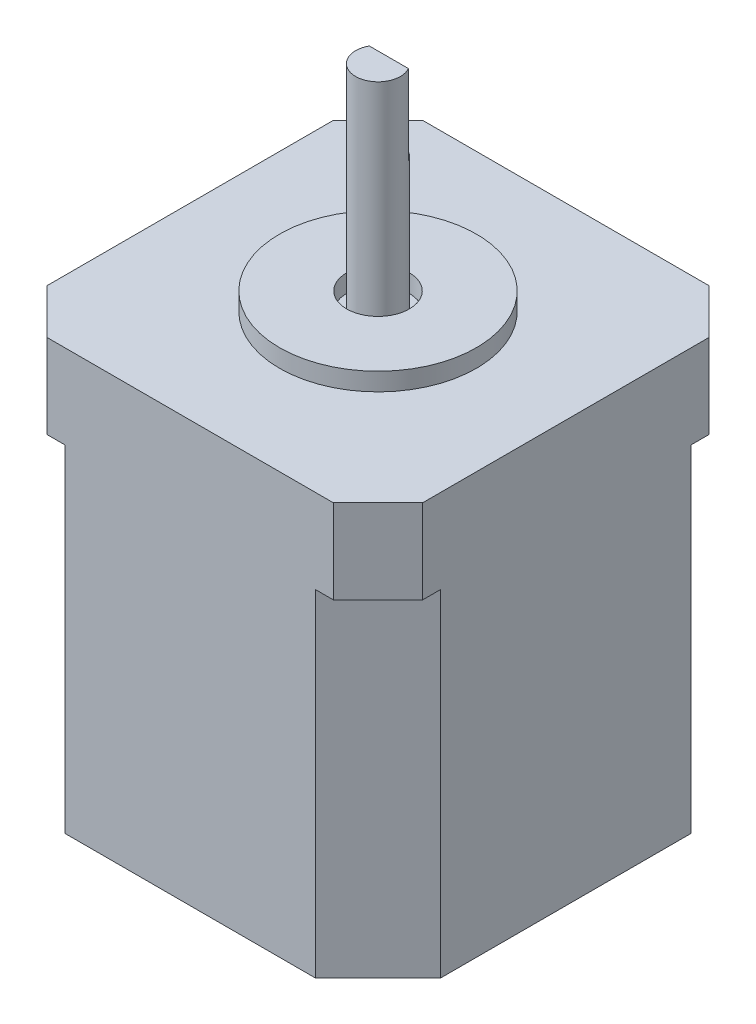
ISO-10303-21;
HEADER;
FILE_DESCRIPTION(('STEP AP214'),'2;1');
FILE_NAME('part.step','',(''),(''),'','','');
FILE_SCHEMA(('AUTOMOTIVE_DESIGN { 1 0 10303 214 1 1 1 1 }'));
ENDSEC;
DATA;
#1=APPLICATION_CONTEXT('core data for automotive mechanical design processes');
#2=APPLICATION_PROTOCOL_DEFINITION('international standard','automotive_design',2000,#1);
#3=PRODUCT_CONTEXT('',#1,'mechanical');
#4=PRODUCT('Part','Part','',(#3));
#5=PRODUCT_RELATED_PRODUCT_CATEGORY('part','',(#4));
#6=PRODUCT_DEFINITION_FORMATION('','',#4);
#7=PRODUCT_DEFINITION_CONTEXT('part definition',#1,'design');
#8=PRODUCT_DEFINITION('design','',#6,#7);
#9=PRODUCT_DEFINITION_SHAPE('','',#8);
#10=(LENGTH_UNIT() NAMED_UNIT(*) SI_UNIT(.MILLI.,.METRE.));
#11=(NAMED_UNIT(*) PLANE_ANGLE_UNIT() SI_UNIT($,.RADIAN.));
#12=(NAMED_UNIT(*) SI_UNIT($,.STERADIAN.) SOLID_ANGLE_UNIT());
#13=UNCERTAINTY_MEASURE_WITH_UNIT(LENGTH_MEASURE(1.E-05),#10,'distance_accuracy_value','');
#14=(GEOMETRIC_REPRESENTATION_CONTEXT(3) GLOBAL_UNCERTAINTY_ASSIGNED_CONTEXT((#13)) GLOBAL_UNIT_ASSIGNED_CONTEXT((#10,
#11,#12)) REPRESENTATION_CONTEXT('',''));
#15=CARTESIAN_POINT('',(0.,0.,0.));
#16=DIRECTION('',(0.,0.,1.));
#17=DIRECTION('',(1.,0.,0.));
#18=AXIS2_PLACEMENT_3D('',#15,#16,#17);
#19=CARTESIAN_POINT('',(0.,71.,0.));
#20=DIRECTION('',(0.,-1.,0.));
#21=DIRECTION('',(0.,0.,-1.));
#22=AXIS2_PLACEMENT_3D('',#19,#20,#21);
#23=CYLINDRICAL_SURFACE('',#22,2.5);
#24=CARTESIAN_POINT('',(0.,47.,0.));
#25=DIRECTION('',(0.,-1.,0.));
#26=DIRECTION('',(0.,0.,-1.));
#27=AXIS2_PLACEMENT_3D('',#24,#25,#26);
#28=CIRCLE('',#27,2.5);
#29=CARTESIAN_POINT('',(0.,47.,-2.5));
#30=VERTEX_POINT('',#29);
#31=EDGE_CURVE('E194',#30,#30,#28,.F.);
#32=ORIENTED_EDGE('',*,*,#31,.T.);
#33=EDGE_LOOP('',(#32));
#34=FACE_BOUND('',#33,.T.);
#35=DIRECTION('',(0.,-1.,0.));
#36=VECTOR('',#35,1.);
#37=CARTESIAN_POINT('',(2.18278026465211,71.,-1.21879871851149));
#38=LINE('',#37,#36);
#39=CARTESIAN_POINT('',(2.18278026465211,71.,-1.21879871851149));
#40=VERTEX_POINT('',#39);
#41=CARTESIAN_POINT('',(2.18278026465211,62.,-1.21879871851149));
#42=VERTEX_POINT('',#41);
#43=EDGE_CURVE('E165',#40,#42,#38,.T.);
#44=ORIENTED_EDGE('',*,*,#43,.F.);
#45=CARTESIAN_POINT('',(0.,71.,0.));
#46=DIRECTION('',(0.,1.,0.));
#47=DIRECTION('',(0.,0.,1.));
#48=AXIS2_PLACEMENT_3D('',#45,#46,#47);
#49=CIRCLE('',#48,2.5);
#50=CARTESIAN_POINT('',(-2.18278026465211,71.,-1.21879871851149));
#51=VERTEX_POINT('',#50);
#52=EDGE_CURVE('E173',#51,#40,#49,.T.);
#53=ORIENTED_EDGE('',*,*,#52,.F.);
#54=DIRECTION('',(0.,-1.,0.));
#55=VECTOR('',#54,1.);
#56=CARTESIAN_POINT('',(-2.18278026465211,71.,-1.21879871851149));
#57=LINE('',#56,#55);
#58=CARTESIAN_POINT('',(-2.18278026465211,62.,-1.21879871851149));
#59=VERTEX_POINT('',#58);
#60=EDGE_CURVE('E56',#59,#51,#57,.F.);
#61=ORIENTED_EDGE('',*,*,#60,.F.);
#62=CARTESIAN_POINT('',(0.,62.,0.));
#63=DIRECTION('',(0.,1.,0.));
#64=DIRECTION('',(0.,0.,1.));
#65=AXIS2_PLACEMENT_3D('',#62,#63,#64);
#66=CIRCLE('',#65,2.5);
#67=EDGE_CURVE('E12',#42,#59,#66,.T.);
#68=ORIENTED_EDGE('',*,*,#67,.F.);
#69=EDGE_LOOP('',(#44,#53,#61,#68));
#70=FACE_BOUND('',#69,.T.);
#71=ADVANCED_FACE('F41',(#34,#70),#23,.T.);
#72=CARTESIAN_POINT('',(0.,71.,0.));
#73=DIRECTION('',(0.,1.,0.));
#74=DIRECTION('',(0.,0.,1.));
#75=AXIS2_PLACEMENT_3D('',#72,#73,#74);
#76=PLANE('',#75);
#77=ORIENTED_EDGE('',*,*,#52,.T.);
#78=DIRECTION('',(-1.,0.,0.));
#79=VECTOR('',#78,1.);
#80=CARTESIAN_POINT('',(0.,71.,-1.21879871851149));
#81=LINE('',#80,#79);
#82=EDGE_CURVE('E49',#40,#51,#81,.T.);
#83=ORIENTED_EDGE('',*,*,#82,.T.);
#84=EDGE_LOOP('',(#77,#83));
#85=FACE_BOUND('',#84,.T.);
#86=ADVANCED_FACE('F306',(#85),#76,.T.);
#87=CARTESIAN_POINT('',(-21.,9.4,21.));
#88=DIRECTION('',(0.,0.,-1.));
#89=DIRECTION('',(-1.,0.,0.));
#90=AXIS2_PLACEMENT_3D('',#87,#88,#89);
#91=PLANE('',#90);
#92=DIRECTION('',(1.,0.,0.));
#93=VECTOR('',#92,1.);
#94=CARTESIAN_POINT('',(-21.,47.,21.));
#95=LINE('',#94,#93);
#96=CARTESIAN_POINT('',(-16.,47.,21.));
#97=VERTEX_POINT('',#96);
#98=CARTESIAN_POINT('',(16.,47.,21.));
#99=VERTEX_POINT('',#98);
#100=EDGE_CURVE('E205',#97,#99,#95,.T.);
#101=ORIENTED_EDGE('',*,*,#100,.F.);
#102=DIRECTION('',(0.,-1.,0.));
#103=VECTOR('',#102,1.);
#104=CARTESIAN_POINT('',(-16.,37.6,21.));
#105=LINE('',#104,#103);
#106=CARTESIAN_POINT('',(-16.,37.6,21.));
#107=VERTEX_POINT('',#106);
#108=EDGE_CURVE('E272',#97,#107,#105,.T.);
#109=ORIENTED_EDGE('',*,*,#108,.T.);
#110=DIRECTION('',(1.,0.,0.));
#111=VECTOR('',#110,1.);
#112=CARTESIAN_POINT('',(-21.,37.6,21.));
#113=LINE('',#112,#111);
#114=CARTESIAN_POINT('',(-14.,37.6,21.));
#115=VERTEX_POINT('',#114);
#116=EDGE_CURVE('E199',#107,#115,#113,.T.);
#117=ORIENTED_EDGE('',*,*,#116,.T.);
#118=DIRECTION('',(0.,-1.,0.));
#119=VECTOR('',#118,1.);
#120=CARTESIAN_POINT('',(-14.,9.4,21.));
#121=LINE('',#120,#119);
#122=CARTESIAN_POINT('',(-14.,0.,21.));
#123=VERTEX_POINT('',#122);
#124=EDGE_CURVE('E243',#115,#123,#121,.T.);
#125=ORIENTED_EDGE('',*,*,#124,.T.);
#126=DIRECTION('',(1.,0.,0.));
#127=VECTOR('',#126,1.);
#128=CARTESIAN_POINT('',(-21.,0.,21.));
#129=LINE('',#128,#127);
#130=CARTESIAN_POINT('',(13.9999999999999,0.,21.));
#131=VERTEX_POINT('',#130);
#132=EDGE_CURVE('E208',#123,#131,#129,.T.);
#133=ORIENTED_EDGE('',*,*,#132,.T.);
#134=DIRECTION('',(0.,1.,0.));
#135=VECTOR('',#134,1.);
#136=CARTESIAN_POINT('',(14.,9.4,21.));
#137=LINE('',#136,#135);
#138=CARTESIAN_POINT('',(13.9999999999999,37.6,21.));
#139=VERTEX_POINT('',#138);
#140=EDGE_CURVE('E246',#131,#139,#137,.T.);
#141=ORIENTED_EDGE('',*,*,#140,.T.);
#142=CARTESIAN_POINT('',(16.,37.6,21.));
#143=VERTEX_POINT('',#142);
#144=EDGE_CURVE('E217',#139,#143,#113,.T.);
#145=ORIENTED_EDGE('',*,*,#144,.T.);
#146=DIRECTION('',(0.,1.,0.));
#147=VECTOR('',#146,1.);
#148=CARTESIAN_POINT('',(16.,9.4,21.));
#149=LINE('',#148,#147);
#150=EDGE_CURVE('E270',#143,#99,#149,.T.);
#151=ORIENTED_EDGE('',*,*,#150,.T.);
#152=EDGE_LOOP('',(#101,#109,#117,#125,#133,#141,#145,#151));
#153=FACE_BOUND('',#152,.T.);
#154=ADVANCED_FACE('F308',(#153),#91,.F.);
#155=CARTESIAN_POINT('',(21.,9.4,21.));
#156=DIRECTION('',(-1.,0.,0.));
#157=DIRECTION('',(0.,0.,1.));
#158=AXIS2_PLACEMENT_3D('',#155,#156,#157);
#159=PLANE('',#158);
#160=DIRECTION('',(0.,0.,-1.));
#161=VECTOR('',#160,1.);
#162=CARTESIAN_POINT('',(21.,47.,21.));
#163=LINE('',#162,#161);
#164=CARTESIAN_POINT('',(21.,47.,16.));
#165=VERTEX_POINT('',#164);
#166=CARTESIAN_POINT('',(21.,47.,-16.));
#167=VERTEX_POINT('',#166);
#168=EDGE_CURVE('E195',#165,#167,#163,.T.);
#169=ORIENTED_EDGE('',*,*,#168,.F.);
#170=DIRECTION('',(0.,-1.,0.));
#171=VECTOR('',#170,1.);
#172=CARTESIAN_POINT('',(21.,9.4,16.));
#173=LINE('',#172,#171);
#174=CARTESIAN_POINT('',(21.,37.6,16.));
#175=VERTEX_POINT('',#174);
#176=EDGE_CURVE('E292',#165,#175,#173,.T.);
#177=ORIENTED_EDGE('',*,*,#176,.T.);
#178=DIRECTION('',(0.,0.,-1.));
#179=VECTOR('',#178,1.);
#180=CARTESIAN_POINT('',(21.,37.6,21.));
#181=LINE('',#180,#179);
#182=CARTESIAN_POINT('',(21.,37.6,14.));
#183=VERTEX_POINT('',#182);
#184=EDGE_CURVE('E209',#175,#183,#181,.T.);
#185=ORIENTED_EDGE('',*,*,#184,.T.);
#186=DIRECTION('',(0.,-1.,0.));
#187=VECTOR('',#186,1.);
#188=CARTESIAN_POINT('',(21.,9.4,14.));
#189=LINE('',#188,#187);
#190=CARTESIAN_POINT('',(21.,0.,14.));
#191=VERTEX_POINT('',#190);
#192=EDGE_CURVE('E232',#183,#191,#189,.T.);
#193=ORIENTED_EDGE('',*,*,#192,.T.);
#194=DIRECTION('',(0.,0.,-1.));
#195=VECTOR('',#194,1.);
#196=CARTESIAN_POINT('',(21.,0.,21.));
#197=LINE('',#196,#195);
#198=CARTESIAN_POINT('',(21.,0.,-14.));
#199=VERTEX_POINT('',#198);
#200=EDGE_CURVE('E221',#191,#199,#197,.T.);
#201=ORIENTED_EDGE('',*,*,#200,.T.);
#202=DIRECTION('',(0.,1.,0.));
#203=VECTOR('',#202,1.);
#204=CARTESIAN_POINT('',(21.,37.6,-14.));
#205=LINE('',#204,#203);
#206=CARTESIAN_POINT('',(21.,37.6,-14.));
#207=VERTEX_POINT('',#206);
#208=EDGE_CURVE('E230',#199,#207,#205,.T.);
#209=ORIENTED_EDGE('',*,*,#208,.T.);
#210=CARTESIAN_POINT('',(21.,37.6,-16.));
#211=VERTEX_POINT('',#210);
#212=EDGE_CURVE('E190',#207,#211,#181,.T.);
#213=ORIENTED_EDGE('',*,*,#212,.T.);
#214=DIRECTION('',(0.,1.,0.));
#215=VECTOR('',#214,1.);
#216=CARTESIAN_POINT('',(21.,47.,-16.));
#217=LINE('',#216,#215);
#218=EDGE_CURVE('E290',#211,#167,#217,.T.);
#219=ORIENTED_EDGE('',*,*,#218,.T.);
#220=EDGE_LOOP('',(#169,#177,#185,#193,#201,#209,#213,#219));
#221=FACE_BOUND('',#220,.T.);
#222=ADVANCED_FACE('F314',(#221),#159,.F.);
#223=CARTESIAN_POINT('',(-21.,9.4,-21.));
#224=DIRECTION('',(0.,0.,-1.));
#225=DIRECTION('',(-1.,0.,0.));
#226=AXIS2_PLACEMENT_3D('',#223,#224,#225);
#227=PLANE('',#226);
#228=DIRECTION('',(-1.,0.,0.));
#229=VECTOR('',#228,1.);
#230=CARTESIAN_POINT('',(-21.,37.6,-21.));
#231=LINE('',#230,#229);
#232=CARTESIAN_POINT('',(-14.,37.6,-21.));
#233=VERTEX_POINT('',#232);
#234=CARTESIAN_POINT('',(-16.,37.6,-21.));
#235=VERTEX_POINT('',#234);
#236=EDGE_CURVE('E211',#233,#235,#231,.T.);
#237=ORIENTED_EDGE('',*,*,#236,.T.);
#238=DIRECTION('',(0.,1.,0.));
#239=VECTOR('',#238,1.);
#240=CARTESIAN_POINT('',(-16.,9.4,-21.));
#241=LINE('',#240,#239);
#242=CARTESIAN_POINT('',(-16.,47.,-21.));
#243=VERTEX_POINT('',#242);
#244=EDGE_CURVE('E301',#235,#243,#241,.T.);
#245=ORIENTED_EDGE('',*,*,#244,.T.);
#246=DIRECTION('',(-1.,0.,0.));
#247=VECTOR('',#246,1.);
#248=CARTESIAN_POINT('',(-21.,47.,-21.));
#249=LINE('',#248,#247);
#250=CARTESIAN_POINT('',(16.,47.,-21.));
#251=VERTEX_POINT('',#250);
#252=EDGE_CURVE('E198',#251,#243,#249,.T.);
#253=ORIENTED_EDGE('',*,*,#252,.F.);
#254=DIRECTION('',(0.,-1.,0.));
#255=VECTOR('',#254,1.);
#256=CARTESIAN_POINT('',(16.,37.6,-21.));
#257=LINE('',#256,#255);
#258=CARTESIAN_POINT('',(16.,37.6,-21.));
#259=VERTEX_POINT('',#258);
#260=EDGE_CURVE('E299',#251,#259,#257,.T.);
#261=ORIENTED_EDGE('',*,*,#260,.T.);
#262=CARTESIAN_POINT('',(13.9999999999999,37.6,-21.));
#263=VERTEX_POINT('',#262);
#264=EDGE_CURVE('E212',#259,#263,#231,.T.);
#265=ORIENTED_EDGE('',*,*,#264,.T.);
#266=DIRECTION('',(0.,-1.,0.));
#267=VECTOR('',#266,1.);
#268=CARTESIAN_POINT('',(14.,9.4,-21.));
#269=LINE('',#268,#267);
#270=CARTESIAN_POINT('',(13.9999999999999,0.,-21.));
#271=VERTEX_POINT('',#270);
#272=EDGE_CURVE('E265',#263,#271,#269,.T.);
#273=ORIENTED_EDGE('',*,*,#272,.T.);
#274=DIRECTION('',(1.,0.,0.));
#275=VECTOR('',#274,1.);
#276=CARTESIAN_POINT('',(-21.,0.,-21.));
#277=LINE('',#276,#275);
#278=CARTESIAN_POINT('',(-14.,0.,-21.));
#279=VERTEX_POINT('',#278);
#280=EDGE_CURVE('E224',#279,#271,#277,.T.);
#281=ORIENTED_EDGE('',*,*,#280,.F.);
#282=DIRECTION('',(0.,1.,0.));
#283=VECTOR('',#282,1.);
#284=CARTESIAN_POINT('',(-14.,9.4,-21.));
#285=LINE('',#284,#283);
#286=EDGE_CURVE('E268',#279,#233,#285,.T.);
#287=ORIENTED_EDGE('',*,*,#286,.T.);
#288=EDGE_LOOP('',(#237,#245,#253,#261,#265,#273,#281,#287));
#289=FACE_BOUND('',#288,.T.);
#290=ADVANCED_FACE('F354',(#289),#227,.T.);
#291=CARTESIAN_POINT('',(-21.,9.4,21.));
#292=DIRECTION('',(-1.,0.,0.));
#293=DIRECTION('',(0.,0.,1.));
#294=AXIS2_PLACEMENT_3D('',#291,#292,#293);
#295=PLANE('',#294);
#296=DIRECTION('',(0.,0.,1.));
#297=VECTOR('',#296,1.);
#298=CARTESIAN_POINT('',(-21.,37.6,21.));
#299=LINE('',#298,#297);
#300=CARTESIAN_POINT('',(-21.,37.6,14.));
#301=VERTEX_POINT('',#300);
#302=CARTESIAN_POINT('',(-21.,37.6,16.));
#303=VERTEX_POINT('',#302);
#304=EDGE_CURVE('E214',#301,#303,#299,.T.);
#305=ORIENTED_EDGE('',*,*,#304,.T.);
#306=DIRECTION('',(0.,1.,0.));
#307=VECTOR('',#306,1.);
#308=CARTESIAN_POINT('',(-21.,47.,16.));
#309=LINE('',#308,#307);
#310=CARTESIAN_POINT('',(-21.,47.,16.));
#311=VERTEX_POINT('',#310);
#312=EDGE_CURVE('E280',#303,#311,#309,.T.);
#313=ORIENTED_EDGE('',*,*,#312,.T.);
#314=DIRECTION('',(0.,0.,1.));
#315=VECTOR('',#314,1.);
#316=CARTESIAN_POINT('',(-21.,47.,21.));
#317=LINE('',#316,#315);
#318=CARTESIAN_POINT('',(-21.,47.,-16.));
#319=VERTEX_POINT('',#318);
#320=EDGE_CURVE('E202',#319,#311,#317,.T.);
#321=ORIENTED_EDGE('',*,*,#320,.F.);
#322=DIRECTION('',(0.,-1.,0.));
#323=VECTOR('',#322,1.);
#324=CARTESIAN_POINT('',(-21.,9.4,-16.));
#325=LINE('',#324,#323);
#326=CARTESIAN_POINT('',(-21.,37.6,-16.));
#327=VERTEX_POINT('',#326);
#328=EDGE_CURVE('E277',#319,#327,#325,.T.);
#329=ORIENTED_EDGE('',*,*,#328,.T.);
#330=CARTESIAN_POINT('',(-21.,37.6,-14.));
#331=VERTEX_POINT('',#330);
#332=EDGE_CURVE('E215',#327,#331,#299,.T.);
#333=ORIENTED_EDGE('',*,*,#332,.T.);
#334=DIRECTION('',(0.,-1.,0.));
#335=VECTOR('',#334,1.);
#336=CARTESIAN_POINT('',(-21.,9.4,-14.));
#337=LINE('',#336,#335);
#338=CARTESIAN_POINT('',(-21.,0.,-14.));
#339=VERTEX_POINT('',#338);
#340=EDGE_CURVE('E260',#331,#339,#337,.T.);
#341=ORIENTED_EDGE('',*,*,#340,.T.);
#342=DIRECTION('',(0.,0.,-1.));
#343=VECTOR('',#342,1.);
#344=CARTESIAN_POINT('',(-21.,0.,21.));
#345=LINE('',#344,#343);
#346=CARTESIAN_POINT('',(-21.,0.,14.));
#347=VERTEX_POINT('',#346);
#348=EDGE_CURVE('E227',#347,#339,#345,.T.);
#349=ORIENTED_EDGE('',*,*,#348,.F.);
#350=DIRECTION('',(0.,1.,0.));
#351=VECTOR('',#350,1.);
#352=CARTESIAN_POINT('',(-21.,37.6,14.));
#353=LINE('',#352,#351);
#354=EDGE_CURVE('E263',#347,#301,#353,.T.);
#355=ORIENTED_EDGE('',*,*,#354,.T.);
#356=EDGE_LOOP('',(#305,#313,#321,#329,#333,#341,#349,#355));
#357=FACE_BOUND('',#356,.T.);
#358=ADVANCED_FACE('F350',(#357),#295,.T.);
#359=CARTESIAN_POINT('',(0.,0.,0.));
#360=DIRECTION('',(0.,1.,0.));
#361=DIRECTION('',(0.,0.,1.));
#362=AXIS2_PLACEMENT_3D('',#359,#360,#361);
#363=PLANE('',#362);
#364=ORIENTED_EDGE('',*,*,#200,.F.);
#365=DIRECTION('',(0.707106781186549,0.,-0.707106781186546));
#366=VECTOR('',#365,1.);
#367=CARTESIAN_POINT('',(21.,0.,14.));
#368=LINE('',#367,#366);
#369=EDGE_CURVE('E241',#191,#131,#368,.F.);
#370=ORIENTED_EDGE('',*,*,#369,.T.);
#371=ORIENTED_EDGE('',*,*,#132,.F.);
#372=DIRECTION('',(-0.707106781186546,0.,-0.707106781186549));
#373=VECTOR('',#372,1.);
#374=CARTESIAN_POINT('',(-14.,0.,21.));
#375=LINE('',#374,#373);
#376=EDGE_CURVE('E239',#123,#347,#375,.T.);
#377=ORIENTED_EDGE('',*,*,#376,.T.);
#378=ORIENTED_EDGE('',*,*,#348,.T.);
#379=DIRECTION('',(-0.707106781186549,0.,0.707106781186547));
#380=VECTOR('',#379,1.);
#381=CARTESIAN_POINT('',(-21.,0.,-14.));
#382=LINE('',#381,#380);
#383=EDGE_CURVE('E237',#339,#279,#382,.F.);
#384=ORIENTED_EDGE('',*,*,#383,.T.);
#385=ORIENTED_EDGE('',*,*,#280,.T.);
#386=DIRECTION('',(0.707106781186549,0.,0.707106781186546));
#387=VECTOR('',#386,1.);
#388=CARTESIAN_POINT('',(14.,0.,-21.));
#389=LINE('',#388,#387);
#390=EDGE_CURVE('E235',#271,#199,#389,.T.);
#391=ORIENTED_EDGE('',*,*,#390,.T.);
#392=EDGE_LOOP('',(#364,#370,#371,#377,#378,#384,#385,#391));
#393=FACE_BOUND('',#392,.T.);
#394=ADVANCED_FACE('F346',(#393),#363,.F.);
#395=CARTESIAN_POINT('',(21.,9.4,14.));
#396=DIRECTION('',(-0.707106781186546,0.,-0.707106781186549));
#397=DIRECTION('',(0.,-1.,0.));
#398=AXIS2_PLACEMENT_3D('',#395,#396,#397);
#399=PLANE('',#398);
#400=DIRECTION('',(-0.707106781186549,0.,0.707106781186546));
#401=VECTOR('',#400,1.);
#402=CARTESIAN_POINT('',(21.,37.6,14.));
#403=LINE('',#402,#401);
#404=EDGE_CURVE('E257',#139,#183,#403,.F.);
#405=ORIENTED_EDGE('',*,*,#404,.F.);
#406=ORIENTED_EDGE('',*,*,#140,.F.);
#407=ORIENTED_EDGE('',*,*,#369,.F.);
#408=ORIENTED_EDGE('',*,*,#192,.F.);
#409=EDGE_LOOP('',(#405,#406,#407,#408));
#410=FACE_BOUND('',#409,.T.);
#411=ADVANCED_FACE('F349',(#410),#399,.F.);
#412=CARTESIAN_POINT('',(-14.,9.4,21.));
#413=DIRECTION('',(-0.707106781186549,0.,0.707106781186546));
#414=DIRECTION('',(0.,1.,0.));
#415=AXIS2_PLACEMENT_3D('',#412,#413,#414);
#416=PLANE('',#415);
#417=DIRECTION('',(0.707106781186546,0.,0.707106781186549));
#418=VECTOR('',#417,1.);
#419=CARTESIAN_POINT('',(-14.,37.6,21.));
#420=LINE('',#419,#418);
#421=EDGE_CURVE('E254',#301,#115,#420,.T.);
#422=ORIENTED_EDGE('',*,*,#421,.F.);
#423=ORIENTED_EDGE('',*,*,#354,.F.);
#424=ORIENTED_EDGE('',*,*,#376,.F.);
#425=ORIENTED_EDGE('',*,*,#124,.F.);
#426=EDGE_LOOP('',(#422,#423,#424,#425));
#427=FACE_BOUND('',#426,.T.);
#428=ADVANCED_FACE('F364',(#427),#416,.T.);
#429=CARTESIAN_POINT('',(-21.,9.4,-14.));
#430=DIRECTION('',(0.707106781186546,0.,0.707106781186548));
#431=DIRECTION('',(0.,-1.,0.));
#432=AXIS2_PLACEMENT_3D('',#429,#430,#431);
#433=PLANE('',#432);
#434=DIRECTION('',(0.707106781186549,0.,-0.707106781186547));
#435=VECTOR('',#434,1.);
#436=CARTESIAN_POINT('',(-21.,37.6,-14.));
#437=LINE('',#436,#435);
#438=EDGE_CURVE('E251',#233,#331,#437,.F.);
#439=ORIENTED_EDGE('',*,*,#438,.F.);
#440=ORIENTED_EDGE('',*,*,#286,.F.);
#441=ORIENTED_EDGE('',*,*,#383,.F.);
#442=ORIENTED_EDGE('',*,*,#340,.F.);
#443=EDGE_LOOP('',(#439,#440,#441,#442));
#444=FACE_BOUND('',#443,.T.);
#445=ADVANCED_FACE('F368',(#444),#433,.F.);
#446=CARTESIAN_POINT('',(14.,9.4,-21.));
#447=DIRECTION('',(0.707106781186546,0.,-0.707106781186549));
#448=DIRECTION('',(0.,1.,0.));
#449=AXIS2_PLACEMENT_3D('',#446,#447,#448);
#450=PLANE('',#449);
#451=DIRECTION('',(-0.707106781186549,0.,-0.707106781186546));
#452=VECTOR('',#451,1.);
#453=CARTESIAN_POINT('',(14.,37.6,-21.));
#454=LINE('',#453,#452);
#455=EDGE_CURVE('E248',#207,#263,#454,.T.);
#456=ORIENTED_EDGE('',*,*,#455,.F.);
#457=ORIENTED_EDGE('',*,*,#208,.F.);
#458=ORIENTED_EDGE('',*,*,#390,.F.);
#459=ORIENTED_EDGE('',*,*,#272,.F.);
#460=EDGE_LOOP('',(#456,#457,#458,#459));
#461=FACE_BOUND('',#460,.T.);
#462=ADVANCED_FACE('F372',(#461),#450,.T.);
#463=CARTESIAN_POINT('',(0.,37.6,0.));
#464=DIRECTION('',(0.,-1.,0.));
#465=DIRECTION('',(0.,0.,-1.));
#466=AXIS2_PLACEMENT_3D('',#463,#464,#465);
#467=PLANE('',#466);
#468=ORIENTED_EDGE('',*,*,#184,.F.);
#469=DIRECTION('',(0.707106781186549,0.,-0.707106781186546));
#470=VECTOR('',#469,1.);
#471=CARTESIAN_POINT('',(18.4999999999999,37.6,18.5));
#472=LINE('',#471,#470);
#473=EDGE_CURVE('E295',#175,#143,#472,.F.);
#474=ORIENTED_EDGE('',*,*,#473,.T.);
#475=ORIENTED_EDGE('',*,*,#144,.F.);
#476=ORIENTED_EDGE('',*,*,#404,.T.);
#477=EDGE_LOOP('',(#468,#474,#475,#476));
#478=FACE_BOUND('',#477,.T.);
#479=ADVANCED_FACE('F345',(#478),#467,.T.);
#480=ORIENTED_EDGE('',*,*,#264,.F.);
#481=DIRECTION('',(0.707106781186546,0.,0.70710678118655));
#482=VECTOR('',#481,1.);
#483=CARTESIAN_POINT('',(18.5,37.6,-18.4999999999999));
#484=LINE('',#483,#482);
#485=EDGE_CURVE('E64',#259,#211,#484,.T.);
#486=ORIENTED_EDGE('',*,*,#485,.T.);
#487=ORIENTED_EDGE('',*,*,#212,.F.);
#488=ORIENTED_EDGE('',*,*,#455,.T.);
#489=EDGE_LOOP('',(#480,#486,#487,#488));
#490=FACE_BOUND('',#489,.T.);
#491=ADVANCED_FACE('F427',(#490),#467,.T.);
#492=ORIENTED_EDGE('',*,*,#332,.F.);
#493=DIRECTION('',(-0.707106781186549,0.,0.707106781186546));
#494=VECTOR('',#493,1.);
#495=CARTESIAN_POINT('',(-18.5,37.6,-18.5));
#496=LINE('',#495,#494);
#497=EDGE_CURVE('E297',#327,#235,#496,.F.);
#498=ORIENTED_EDGE('',*,*,#497,.T.);
#499=ORIENTED_EDGE('',*,*,#236,.F.);
#500=ORIENTED_EDGE('',*,*,#438,.T.);
#501=EDGE_LOOP('',(#492,#498,#499,#500));
#502=FACE_BOUND('',#501,.T.);
#503=ADVANCED_FACE('F339',(#502),#467,.T.);
#504=CARTESIAN_POINT('',(0.,47.,0.));
#505=DIRECTION('',(0.,-1.,0.));
#506=DIRECTION('',(0.,0.,-1.));
#507=AXIS2_PLACEMENT_3D('',#504,#505,#506);
#508=PLANE('',#507);
#509=CARTESIAN_POINT('',(0.,47.,0.));
#510=DIRECTION('',(0.,1.,0.));
#511=DIRECTION('',(0.,0.,1.));
#512=AXIS2_PLACEMENT_3D('',#509,#510,#511);
#513=CIRCLE('',#512,11.);
#514=CARTESIAN_POINT('',(0.,47.,11.));
#515=VERTEX_POINT('',#514);
#516=EDGE_CURVE('E191',#515,#515,#513,.T.);
#517=ORIENTED_EDGE('',*,*,#516,.F.);
#518=EDGE_LOOP('',(#517));
#519=FACE_BOUND('',#518,.T.);
#520=ORIENTED_EDGE('',*,*,#320,.T.);
#521=DIRECTION('',(0.707106781186546,0.,0.70710678118655));
#522=VECTOR('',#521,1.);
#523=CARTESIAN_POINT('',(-16.,47.,21.));
#524=LINE('',#523,#522);
#525=EDGE_CURVE('E288',#311,#97,#524,.T.);
#526=ORIENTED_EDGE('',*,*,#525,.T.);
#527=ORIENTED_EDGE('',*,*,#100,.T.);
#528=DIRECTION('',(-0.707106781186549,0.,0.707106781186546));
#529=VECTOR('',#528,1.);
#530=CARTESIAN_POINT('',(21.,47.,16.));
#531=LINE('',#530,#529);
#532=EDGE_CURVE('E286',#99,#165,#531,.F.);
#533=ORIENTED_EDGE('',*,*,#532,.T.);
#534=ORIENTED_EDGE('',*,*,#168,.T.);
#535=DIRECTION('',(-0.707106781186546,0.,-0.70710678118655));
#536=VECTOR('',#535,1.);
#537=CARTESIAN_POINT('',(16.,47.,-21.));
#538=LINE('',#537,#536);
#539=EDGE_CURVE('E282',#167,#251,#538,.T.);
#540=ORIENTED_EDGE('',*,*,#539,.T.);
#541=ORIENTED_EDGE('',*,*,#252,.T.);
#542=DIRECTION('',(0.707106781186549,0.,-0.707106781186546));
#543=VECTOR('',#542,1.);
#544=CARTESIAN_POINT('',(-21.,47.,-16.));
#545=LINE('',#544,#543);
#546=EDGE_CURVE('E284',#243,#319,#545,.F.);
#547=ORIENTED_EDGE('',*,*,#546,.T.);
#548=EDGE_LOOP('',(#520,#526,#527,#533,#534,#540,#541,#547));
#549=FACE_BOUND('',#548,.T.);
#550=ADVANCED_FACE('F335',(#519,#549),#508,.F.);
#551=ORIENTED_EDGE('',*,*,#116,.F.);
#552=DIRECTION('',(-0.707106781186546,0.,-0.70710678118655));
#553=VECTOR('',#552,1.);
#554=CARTESIAN_POINT('',(-18.5,37.6,18.4999999999999));
#555=LINE('',#554,#553);
#556=EDGE_CURVE('E275',#107,#303,#555,.T.);
#557=ORIENTED_EDGE('',*,*,#556,.T.);
#558=ORIENTED_EDGE('',*,*,#304,.F.);
#559=ORIENTED_EDGE('',*,*,#421,.T.);
#560=EDGE_LOOP('',(#551,#557,#558,#559));
#561=FACE_BOUND('',#560,.T.);
#562=ADVANCED_FACE('F338',(#561),#467,.T.);
#563=CARTESIAN_POINT('',(-16.,9.4,21.));
#564=DIRECTION('',(-0.70710678118655,0.,0.707106781186546));
#565=DIRECTION('',(0.,1.,0.));
#566=AXIS2_PLACEMENT_3D('',#563,#564,#565);
#567=PLANE('',#566);
#568=ORIENTED_EDGE('',*,*,#525,.F.);
#569=ORIENTED_EDGE('',*,*,#312,.F.);
#570=ORIENTED_EDGE('',*,*,#556,.F.);
#571=ORIENTED_EDGE('',*,*,#108,.F.);
#572=EDGE_LOOP('',(#568,#569,#570,#571));
#573=FACE_BOUND('',#572,.T.);
#574=ADVANCED_FACE('F343',(#573),#567,.T.);
#575=CARTESIAN_POINT('',(21.,9.4,16.));
#576=DIRECTION('',(-0.707106781186546,0.,-0.707106781186549));
#577=DIRECTION('',(0.,-1.,0.));
#578=AXIS2_PLACEMENT_3D('',#575,#576,#577);
#579=PLANE('',#578);
#580=ORIENTED_EDGE('',*,*,#532,.F.);
#581=ORIENTED_EDGE('',*,*,#150,.F.);
#582=ORIENTED_EDGE('',*,*,#473,.F.);
#583=ORIENTED_EDGE('',*,*,#176,.F.);
#584=EDGE_LOOP('',(#580,#581,#582,#583));
#585=FACE_BOUND('',#584,.T.);
#586=ADVANCED_FACE('F379',(#585),#579,.F.);
#587=CARTESIAN_POINT('',(-21.,9.4,-16.));
#588=DIRECTION('',(0.707106781186546,0.,0.707106781186549));
#589=DIRECTION('',(0.,-1.,0.));
#590=AXIS2_PLACEMENT_3D('',#587,#588,#589);
#591=PLANE('',#590);
#592=ORIENTED_EDGE('',*,*,#546,.F.);
#593=ORIENTED_EDGE('',*,*,#244,.F.);
#594=ORIENTED_EDGE('',*,*,#497,.F.);
#595=ORIENTED_EDGE('',*,*,#328,.F.);
#596=EDGE_LOOP('',(#592,#593,#594,#595));
#597=FACE_BOUND('',#596,.T.);
#598=ADVANCED_FACE('F382',(#597),#591,.F.);
#599=CARTESIAN_POINT('',(16.,9.4,-21.));
#600=DIRECTION('',(0.707106781186549,0.,-0.707106781186545));
#601=DIRECTION('',(0.,1.,0.));
#602=AXIS2_PLACEMENT_3D('',#599,#600,#601);
#603=PLANE('',#602);
#604=ORIENTED_EDGE('',*,*,#539,.F.);
#605=ORIENTED_EDGE('',*,*,#218,.F.);
#606=ORIENTED_EDGE('',*,*,#485,.F.);
#607=ORIENTED_EDGE('',*,*,#260,.F.);
#608=EDGE_LOOP('',(#604,#605,#606,#607));
#609=FACE_BOUND('',#608,.T.);
#610=ADVANCED_FACE('F43',(#609),#603,.T.);
#611=CARTESIAN_POINT('',(0.,49.,0.));
#612=DIRECTION('',(0.,1.,0.));
#613=DIRECTION('',(0.,0.,1.));
#614=AXIS2_PLACEMENT_3D('',#611,#612,#613);
#615=PLANE('',#614);
#616=CARTESIAN_POINT('',(0.,49.,0.));
#617=DIRECTION('',(0.,1.,0.));
#618=DIRECTION('',(0.,0.,1.));
#619=AXIS2_PLACEMENT_3D('',#616,#617,#618);
#620=CIRCLE('',#619,11.);
#621=CARTESIAN_POINT('',(0.,49.,11.));
#622=VERTEX_POINT('',#621);
#623=EDGE_CURVE('E185',#622,#622,#620,.T.);
#624=ORIENTED_EDGE('',*,*,#623,.T.);
#625=EDGE_LOOP('',(#624));
#626=FACE_BOUND('',#625,.T.);
#627=CARTESIAN_POINT('',(0.,49.,0.));
#628=DIRECTION('',(0.,1.,0.));
#629=DIRECTION('',(0.,0.,1.));
#630=AXIS2_PLACEMENT_3D('',#627,#628,#629);
#631=CIRCLE('',#630,3.5);
#632=CARTESIAN_POINT('',(0.,49.,3.5));
#633=VERTEX_POINT('',#632);
#634=EDGE_CURVE('E182',#633,#633,#631,.T.);
#635=ORIENTED_EDGE('',*,*,#634,.F.);
#636=EDGE_LOOP('',(#635));
#637=FACE_BOUND('',#636,.T.);
#638=ADVANCED_FACE('F328',(#626,#637),#615,.T.);
#639=CARTESIAN_POINT('',(0.,49.,0.));
#640=DIRECTION('',(0.,-1.,0.));
#641=DIRECTION('',(0.,0.,-1.));
#642=AXIS2_PLACEMENT_3D('',#639,#640,#641);
#643=CYLINDRICAL_SURFACE('',#642,11.);
#644=ORIENTED_EDGE('',*,*,#623,.F.);
#645=EDGE_LOOP('',(#644));
#646=FACE_BOUND('',#645,.T.);
#647=ORIENTED_EDGE('',*,*,#516,.T.);
#648=EDGE_LOOP('',(#647));
#649=FACE_BOUND('',#648,.T.);
#650=ADVANCED_FACE('F326',(#646,#649),#643,.T.);
#651=CARTESIAN_POINT('',(0.,49.,0.));
#652=DIRECTION('',(0.,-1.,0.));
#653=DIRECTION('',(0.,0.,-1.));
#654=AXIS2_PLACEMENT_3D('',#651,#652,#653);
#655=CYLINDRICAL_SURFACE('',#654,3.5);
#656=ORIENTED_EDGE('',*,*,#634,.T.);
#657=EDGE_LOOP('',(#656));
#658=FACE_BOUND('',#657,.T.);
#659=CARTESIAN_POINT('',(0.,47.,0.));
#660=DIRECTION('',(0.,1.,0.));
#661=DIRECTION('',(0.,0.,1.));
#662=AXIS2_PLACEMENT_3D('',#659,#660,#661);
#663=CIRCLE('',#662,3.5);
#664=CARTESIAN_POINT('',(0.,47.,3.5));
#665=VERTEX_POINT('',#664);
#666=EDGE_CURVE('E181',#665,#665,#663,.T.);
#667=ORIENTED_EDGE('',*,*,#666,.F.);
#668=EDGE_LOOP('',(#667));
#669=FACE_BOUND('',#668,.T.);
#670=ADVANCED_FACE('F322',(#658,#669),#655,.F.);
#671=ORIENTED_EDGE('',*,*,#31,.F.);
#672=EDGE_LOOP('',(#671));
#673=FACE_BOUND('',#672,.T.);
#674=ORIENTED_EDGE('',*,*,#666,.T.);
#675=EDGE_LOOP('',(#674));
#676=FACE_BOUND('',#675,.T.);
#677=ADVANCED_FACE('F325',(#673,#676),#508,.F.);
#678=CARTESIAN_POINT('',(5.,62.,-3.45844626550075));
#679=DIRECTION('',(0.,1.,0.));
#680=DIRECTION('',(0.,0.,1.));
#681=AXIS2_PLACEMENT_3D('',#678,#679,#680);
#682=PLANE('',#681);
#683=ORIENTED_EDGE('',*,*,#67,.T.);
#684=DIRECTION('',(-1.,0.,0.));
#685=VECTOR('',#684,1.);
#686=CARTESIAN_POINT('',(5.,62.,-1.21879871851149));
#687=LINE('',#686,#685);
#688=EDGE_CURVE('E168',#42,#59,#687,.T.);
#689=ORIENTED_EDGE('',*,*,#688,.F.);
#690=EDGE_LOOP('',(#683,#689));
#691=FACE_BOUND('',#690,.T.);
#692=ADVANCED_FACE('F176',(#691),#682,.T.);
#693=CARTESIAN_POINT('',(5.,73.2424572606859,-1.21879871851149));
#694=DIRECTION('',(0.,0.,-1.));
#695=DIRECTION('',(0.,1.,0.));
#696=AXIS2_PLACEMENT_3D('',#693,#694,#695);
#697=PLANE('',#696);
#698=ORIENTED_EDGE('',*,*,#43,.T.);
#699=ORIENTED_EDGE('',*,*,#688,.T.);
#700=ORIENTED_EDGE('',*,*,#60,.T.);
#701=ORIENTED_EDGE('',*,*,#82,.F.);
#702=EDGE_LOOP('',(#698,#699,#700,#701));
#703=FACE_BOUND('',#702,.T.);
#704=ADVANCED_FACE('F167',(#703),#697,.T.);
#705=CLOSED_SHELL('',(#71,#86,#154,#222,#290,#358,#394,#411,#428,#445,#462,#479,#491,#503,#550,
#562,#574,#586,#598,#610,#638,#650,#670,#677,#692,#704));
#706=MANIFOLD_SOLID_BREP('B2',#705);
#707=ADVANCED_BREP_SHAPE_REPRESENTATION('',(#18,#706),#14);
#708=SHAPE_DEFINITION_REPRESENTATION(#9,#707);
ENDSEC;
END-ISO-10303-21;
